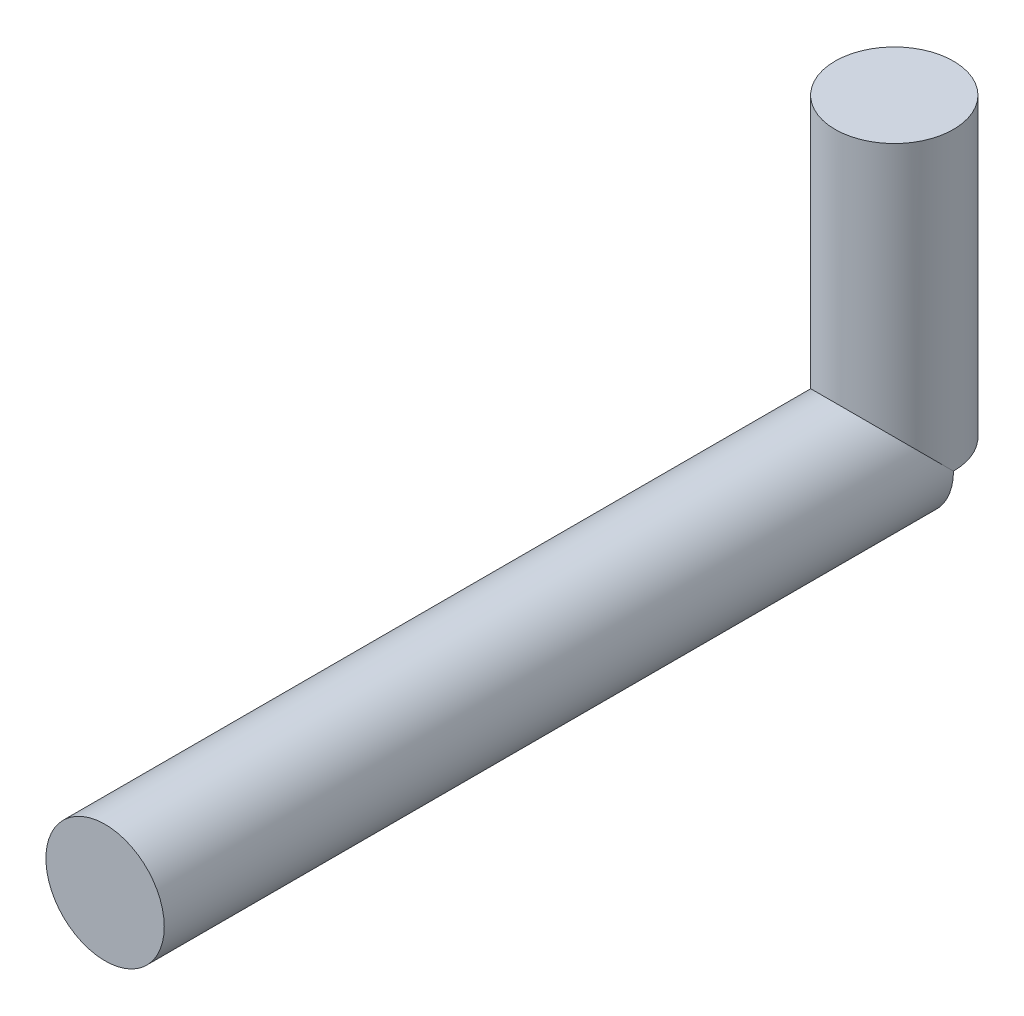
ISO-10303-21;
HEADER;
FILE_DESCRIPTION(('STEP AP214'),'2;1');
FILE_NAME('part.step','',(''),(''),'','','');
FILE_SCHEMA(('AUTOMOTIVE_DESIGN { 1 0 10303 214 1 1 1 1 }'));
ENDSEC;
DATA;
#1=APPLICATION_CONTEXT('core data for automotive mechanical design processes');
#2=APPLICATION_PROTOCOL_DEFINITION('international standard','automotive_design',2000,#1);
#3=PRODUCT_CONTEXT('',#1,'mechanical');
#4=PRODUCT('Part','Part','',(#3));
#5=PRODUCT_RELATED_PRODUCT_CATEGORY('part','',(#4));
#6=PRODUCT_DEFINITION_FORMATION('','',#4);
#7=PRODUCT_DEFINITION_CONTEXT('part definition',#1,'design');
#8=PRODUCT_DEFINITION('design','',#6,#7);
#9=PRODUCT_DEFINITION_SHAPE('','',#8);
#10=(LENGTH_UNIT() NAMED_UNIT(*) SI_UNIT(.MILLI.,.METRE.));
#11=(NAMED_UNIT(*) PLANE_ANGLE_UNIT() SI_UNIT($,.RADIAN.));
#12=(NAMED_UNIT(*) SI_UNIT($,.STERADIAN.) SOLID_ANGLE_UNIT());
#13=UNCERTAINTY_MEASURE_WITH_UNIT(LENGTH_MEASURE(1.E-05),#10,'distance_accuracy_value','');
#14=(GEOMETRIC_REPRESENTATION_CONTEXT(3) GLOBAL_UNCERTAINTY_ASSIGNED_CONTEXT((#13)) GLOBAL_UNIT_ASSIGNED_CONTEXT((#10,
#11,#12)) REPRESENTATION_CONTEXT('',''));
#15=CARTESIAN_POINT('',(0.,0.,0.));
#16=DIRECTION('',(0.,0.,1.));
#17=DIRECTION('',(1.,0.,0.));
#18=AXIS2_PLACEMENT_3D('',#15,#16,#17);
#19=CARTESIAN_POINT('',(0.,0.,4.));
#20=DIRECTION('',(0.,0.,-1.));
#21=DIRECTION('',(-1.,0.,0.));
#22=AXIS2_PLACEMENT_3D('',#19,#20,#21);
#23=CYLINDRICAL_SURFACE('',#22,0.3);
#24=CARTESIAN_POINT('',(0.,0.,4.));
#25=DIRECTION('',(0.,0.,1.));
#26=DIRECTION('',(1.,0.,0.));
#27=AXIS2_PLACEMENT_3D('',#24,#25,#26);
#28=CIRCLE('',#27,0.3);
#29=CARTESIAN_POINT('',(0.3,0.,4.));
#30=VERTEX_POINT('',#29);
#31=EDGE_CURVE('E43',#30,#30,#28,.T.);
#32=ORIENTED_EDGE('',*,*,#31,.F.);
#33=EDGE_LOOP('',(#32));
#34=FACE_BOUND('',#33,.T.);
#35=CARTESIAN_POINT('',(0.,0.,0.));
#36=DIRECTION('',(0.,0.707106781186547,-0.707106781186547));
#37=DIRECTION('',(0.,-0.707106781186547,-0.707106781186547));
#38=AXIS2_PLACEMENT_3D('',#35,#36,#37);
#39=ELLIPSE('',#38,0.424264068711928,0.3);
#40=CARTESIAN_POINT('',(-0.3,0.,0.));
#41=VERTEX_POINT('',#40);
#42=CARTESIAN_POINT('',(0.3,0.,0.));
#43=VERTEX_POINT('',#42);
#44=EDGE_CURVE('E54',#41,#43,#39,.T.);
#45=ORIENTED_EDGE('',*,*,#44,.F.);
#46=CARTESIAN_POINT('',(0.,0.,0.));
#47=DIRECTION('',(0.,0.,1.));
#48=DIRECTION('',(1.,0.,0.));
#49=AXIS2_PLACEMENT_3D('',#46,#47,#48);
#50=CIRCLE('',#49,0.3);
#51=EDGE_CURVE('E49',#41,#43,#50,.T.);
#52=ORIENTED_EDGE('',*,*,#51,.T.);
#53=EDGE_LOOP('',(#45,#52));
#54=FACE_BOUND('',#53,.T.);
#55=ADVANCED_FACE('F36',(#34,#54),#23,.T.);
#56=CARTESIAN_POINT('',(0.,0.,0.));
#57=DIRECTION('',(0.,0.,1.));
#58=DIRECTION('',(1.,0.,0.));
#59=AXIS2_PLACEMENT_3D('',#56,#57,#58);
#60=PLANE('',#59);
#61=DIRECTION('',(-1.,0.,0.));
#62=VECTOR('',#61,1.);
#63=CARTESIAN_POINT('',(0.,0.,0.));
#64=LINE('',#63,#62);
#65=EDGE_CURVE('E11',#43,#41,#64,.T.);
#66=ORIENTED_EDGE('',*,*,#65,.F.);
#67=ORIENTED_EDGE('',*,*,#51,.F.);
#68=EDGE_LOOP('',(#66,#67));
#69=FACE_BOUND('',#68,.T.);
#70=ADVANCED_FACE('F51',(#69),#60,.F.);
#71=CARTESIAN_POINT('',(0.,0.,4.));
#72=DIRECTION('',(0.,0.,1.));
#73=DIRECTION('',(1.,0.,0.));
#74=AXIS2_PLACEMENT_3D('',#71,#72,#73);
#75=PLANE('',#74);
#76=ORIENTED_EDGE('',*,*,#31,.T.);
#77=EDGE_LOOP('',(#76));
#78=FACE_BOUND('',#77,.T.);
#79=ADVANCED_FACE('F71',(#78),#75,.T.);
#80=CARTESIAN_POINT('',(0.,1.5,0.));
#81=DIRECTION('',(0.,-1.,0.));
#82=DIRECTION('',(0.,0.,-1.));
#83=AXIS2_PLACEMENT_3D('',#80,#81,#82);
#84=CYLINDRICAL_SURFACE('',#83,0.3);
#85=CARTESIAN_POINT('',(0.,1.5,0.));
#86=DIRECTION('',(0.,1.,0.));
#87=DIRECTION('',(0.,0.,1.));
#88=AXIS2_PLACEMENT_3D('',#85,#86,#87);
#89=CIRCLE('',#88,0.3);
#90=CARTESIAN_POINT('',(0.,1.5,0.3));
#91=VERTEX_POINT('',#90);
#92=EDGE_CURVE('E58',#91,#91,#89,.T.);
#93=ORIENTED_EDGE('',*,*,#92,.F.);
#94=EDGE_LOOP('',(#93));
#95=FACE_BOUND('',#94,.T.);
#96=CARTESIAN_POINT('',(0.,0.,0.));
#97=DIRECTION('',(0.,1.,0.));
#98=DIRECTION('',(0.,0.,1.));
#99=AXIS2_PLACEMENT_3D('',#96,#97,#98);
#100=CIRCLE('',#99,0.3);
#101=EDGE_CURVE('E62',#43,#41,#100,.T.);
#102=ORIENTED_EDGE('',*,*,#101,.T.);
#103=ORIENTED_EDGE('',*,*,#44,.T.);
#104=EDGE_LOOP('',(#102,#103));
#105=FACE_BOUND('',#104,.T.);
#106=ADVANCED_FACE('F63',(#95,#105),#84,.T.);
#107=CARTESIAN_POINT('',(0.,0.,0.));
#108=DIRECTION('',(0.,1.,0.));
#109=DIRECTION('',(0.,0.,1.));
#110=AXIS2_PLACEMENT_3D('',#107,#108,#109);
#111=PLANE('',#110);
#112=ORIENTED_EDGE('',*,*,#101,.F.);
#113=ORIENTED_EDGE('',*,*,#65,.T.);
#114=EDGE_LOOP('',(#112,#113));
#115=FACE_BOUND('',#114,.T.);
#116=ADVANCED_FACE('F61',(#115),#111,.F.);
#117=CARTESIAN_POINT('',(0.,1.5,0.));
#118=DIRECTION('',(0.,1.,0.));
#119=DIRECTION('',(0.,0.,1.));
#120=AXIS2_PLACEMENT_3D('',#117,#118,#119);
#121=PLANE('',#120);
#122=ORIENTED_EDGE('',*,*,#92,.T.);
#123=EDGE_LOOP('',(#122));
#124=FACE_BOUND('',#123,.T.);
#125=ADVANCED_FACE('F87',(#124),#121,.T.);
#126=CLOSED_SHELL('',(#55,#70,#79,#106,#116,#125));
#127=MANIFOLD_SOLID_BREP('B2',#126);
#128=ADVANCED_BREP_SHAPE_REPRESENTATION('',(#18,#127),#14);
#129=SHAPE_DEFINITION_REPRESENTATION(#9,#128);
ENDSEC;
END-ISO-10303-21;
